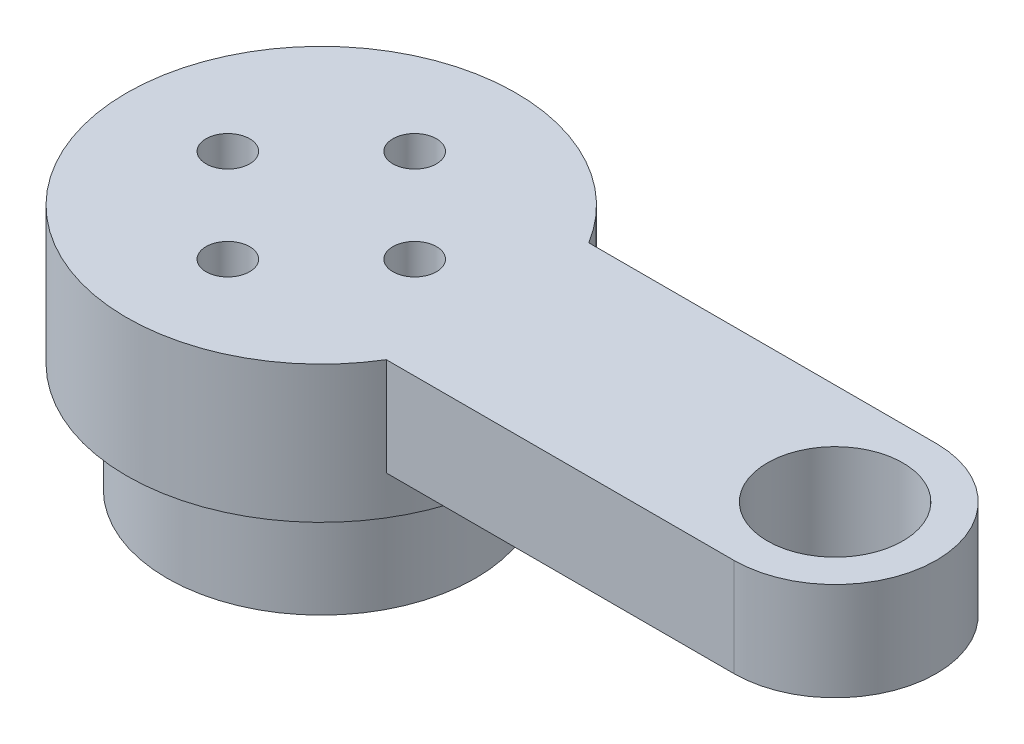
ISO-10303-21;
HEADER;
FILE_DESCRIPTION(('STEP AP214'),'2;1');
FILE_NAME('part.step','',(''),(''),'','','');
FILE_SCHEMA(('AUTOMOTIVE_DESIGN { 1 0 10303 214 1 1 1 1 }'));
ENDSEC;
DATA;
#1=APPLICATION_CONTEXT('core data for automotive mechanical design processes');
#2=APPLICATION_PROTOCOL_DEFINITION('international standard','automotive_design',2000,#1);
#3=PRODUCT_CONTEXT('',#1,'mechanical');
#4=PRODUCT('Part','Part','',(#3));
#5=PRODUCT_RELATED_PRODUCT_CATEGORY('part','',(#4));
#6=PRODUCT_DEFINITION_FORMATION('','',#4);
#7=PRODUCT_DEFINITION_CONTEXT('part definition',#1,'design');
#8=PRODUCT_DEFINITION('design','',#6,#7);
#9=PRODUCT_DEFINITION_SHAPE('','',#8);
#10=(LENGTH_UNIT() NAMED_UNIT(*) SI_UNIT(.MILLI.,.METRE.));
#11=(NAMED_UNIT(*) PLANE_ANGLE_UNIT() SI_UNIT($,.RADIAN.));
#12=(NAMED_UNIT(*) SI_UNIT($,.STERADIAN.) SOLID_ANGLE_UNIT());
#13=UNCERTAINTY_MEASURE_WITH_UNIT(LENGTH_MEASURE(1.E-05),#10,'distance_accuracy_value','');
#14=(GEOMETRIC_REPRESENTATION_CONTEXT(3) GLOBAL_UNCERTAINTY_ASSIGNED_CONTEXT((#13)) GLOBAL_UNIT_ASSIGNED_CONTEXT((#10,
#11,#12)) REPRESENTATION_CONTEXT('',''));
#15=CARTESIAN_POINT('',(0.,0.,0.));
#16=DIRECTION('',(0.,0.,1.));
#17=DIRECTION('',(1.,0.,0.));
#18=AXIS2_PLACEMENT_3D('',#15,#16,#17);
#19=CARTESIAN_POINT('',(0.,0.,0.));
#20=DIRECTION('',(0.,1.,0.));
#21=DIRECTION('',(0.,0.,1.));
#22=AXIS2_PLACEMENT_3D('',#19,#20,#21);
#23=PLANE('',#22);
#24=CARTESIAN_POINT('',(0.,0.,0.));
#25=DIRECTION('',(0.,1.,0.));
#26=DIRECTION('',(0.,0.,1.));
#27=AXIS2_PLACEMENT_3D('',#24,#25,#26);
#28=CIRCLE('',#27,9.9);
#29=CARTESIAN_POINT('',(0.,0.,9.9));
#30=VERTEX_POINT('',#29);
#31=EDGE_CURVE('E41',#30,#30,#28,.T.);
#32=ORIENTED_EDGE('',*,*,#31,.F.);
#33=EDGE_LOOP('',(#32));
#34=FACE_BOUND('',#33,.T.);
#35=CARTESIAN_POINT('',(6.,0.,0.));
#36=DIRECTION('',(0.,1.,0.));
#37=DIRECTION('',(0.,0.,1.));
#38=AXIS2_PLACEMENT_3D('',#35,#36,#37);
#39=CIRCLE('',#38,1.4);
#40=CARTESIAN_POINT('',(6.,0.,1.4));
#41=VERTEX_POINT('',#40);
#42=EDGE_CURVE('E147',#41,#41,#39,.T.);
#43=ORIENTED_EDGE('',*,*,#42,.T.);
#44=EDGE_LOOP('',(#43));
#45=FACE_BOUND('',#44,.T.);
#46=CARTESIAN_POINT('',(0.,0.,6.));
#47=DIRECTION('',(0.,1.,0.));
#48=DIRECTION('',(0.,0.,1.));
#49=AXIS2_PLACEMENT_3D('',#46,#47,#48);
#50=CIRCLE('',#49,1.4);
#51=CARTESIAN_POINT('',(0.,0.,7.4));
#52=VERTEX_POINT('',#51);
#53=EDGE_CURVE('E144',#52,#52,#50,.T.);
#54=ORIENTED_EDGE('',*,*,#53,.T.);
#55=EDGE_LOOP('',(#54));
#56=FACE_BOUND('',#55,.T.);
#57=CARTESIAN_POINT('',(-6.,0.,0.));
#58=DIRECTION('',(0.,1.,0.));
#59=DIRECTION('',(0.,0.,1.));
#60=AXIS2_PLACEMENT_3D('',#57,#58,#59);
#61=CIRCLE('',#60,1.4);
#62=CARTESIAN_POINT('',(-6.,0.,1.4));
#63=VERTEX_POINT('',#62);
#64=EDGE_CURVE('E141',#63,#63,#61,.T.);
#65=ORIENTED_EDGE('',*,*,#64,.T.);
#66=EDGE_LOOP('',(#65));
#67=FACE_BOUND('',#66,.T.);
#68=CARTESIAN_POINT('',(0.,0.,-6.));
#69=DIRECTION('',(0.,1.,0.));
#70=DIRECTION('',(0.,0.,1.));
#71=AXIS2_PLACEMENT_3D('',#68,#69,#70);
#72=CIRCLE('',#71,1.4);
#73=CARTESIAN_POINT('',(0.,0.,-4.6));
#74=VERTEX_POINT('',#73);
#75=EDGE_CURVE('E136',#74,#74,#72,.T.);
#76=ORIENTED_EDGE('',*,*,#75,.T.);
#77=EDGE_LOOP('',(#76));
#78=FACE_BOUND('',#77,.T.);
#79=ADVANCED_FACE('F37',(#34,#45,#56,#67,#78),#23,.F.);
#80=CARTESIAN_POINT('',(0.,7.,0.));
#81=DIRECTION('',(0.,-1.,0.));
#82=DIRECTION('',(0.,0.,-1.));
#83=AXIS2_PLACEMENT_3D('',#80,#81,#82);
#84=CYLINDRICAL_SURFACE('',#83,9.9);
#85=CARTESIAN_POINT('',(0.,7.,0.));
#86=DIRECTION('',(0.,1.,0.));
#87=DIRECTION('',(0.,0.,1.));
#88=AXIS2_PLACEMENT_3D('',#85,#86,#87);
#89=CIRCLE('',#88,9.9);
#90=CARTESIAN_POINT('',(0.,7.,9.9));
#91=VERTEX_POINT('',#90);
#92=EDGE_CURVE('E11',#91,#91,#89,.T.);
#93=ORIENTED_EDGE('',*,*,#92,.F.);
#94=EDGE_LOOP('',(#93));
#95=FACE_BOUND('',#94,.T.);
#96=ORIENTED_EDGE('',*,*,#31,.T.);
#97=EDGE_LOOP('',(#96));
#98=FACE_BOUND('',#97,.T.);
#99=ADVANCED_FACE('F39',(#95,#98),#84,.T.);
#100=CARTESIAN_POINT('',(6.,7.,0.));
#101=DIRECTION('',(0.,-1.,0.));
#102=DIRECTION('',(0.,0.,-1.));
#103=AXIS2_PLACEMENT_3D('',#100,#101,#102);
#104=CYLINDRICAL_SURFACE('',#103,1.4);
#105=ORIENTED_EDGE('',*,*,#42,.F.);
#106=EDGE_LOOP('',(#105));
#107=FACE_BOUND('',#106,.T.);
#108=CARTESIAN_POINT('',(6.,15.8,0.));
#109=DIRECTION('',(0.,1.,0.));
#110=DIRECTION('',(0.,0.,1.));
#111=AXIS2_PLACEMENT_3D('',#108,#109,#110);
#112=CIRCLE('',#111,1.4);
#113=CARTESIAN_POINT('',(6.,15.8,1.4));
#114=VERTEX_POINT('',#113);
#115=EDGE_CURVE('E113',#114,#114,#112,.F.);
#116=ORIENTED_EDGE('',*,*,#115,.F.);
#117=EDGE_LOOP('',(#116));
#118=FACE_BOUND('',#117,.T.);
#119=ADVANCED_FACE('F205',(#107,#118),#104,.F.);
#120=CARTESIAN_POINT('',(0.,7.,6.));
#121=DIRECTION('',(0.,-1.,0.));
#122=DIRECTION('',(0.,0.,-1.));
#123=AXIS2_PLACEMENT_3D('',#120,#121,#122);
#124=CYLINDRICAL_SURFACE('',#123,1.4);
#125=ORIENTED_EDGE('',*,*,#53,.F.);
#126=EDGE_LOOP('',(#125));
#127=FACE_BOUND('',#126,.T.);
#128=CARTESIAN_POINT('',(0.,15.8,6.));
#129=DIRECTION('',(0.,1.,0.));
#130=DIRECTION('',(0.,0.,1.));
#131=AXIS2_PLACEMENT_3D('',#128,#129,#130);
#132=CIRCLE('',#131,1.4);
#133=CARTESIAN_POINT('',(0.,15.8,7.4));
#134=VERTEX_POINT('',#133);
#135=EDGE_CURVE('E116',#134,#134,#132,.F.);
#136=ORIENTED_EDGE('',*,*,#135,.F.);
#137=EDGE_LOOP('',(#136));
#138=FACE_BOUND('',#137,.T.);
#139=ADVANCED_FACE('F201',(#127,#138),#124,.F.);
#140=CARTESIAN_POINT('',(-6.,7.,0.));
#141=DIRECTION('',(0.,-1.,0.));
#142=DIRECTION('',(0.,0.,-1.));
#143=AXIS2_PLACEMENT_3D('',#140,#141,#142);
#144=CYLINDRICAL_SURFACE('',#143,1.4);
#145=ORIENTED_EDGE('',*,*,#64,.F.);
#146=EDGE_LOOP('',(#145));
#147=FACE_BOUND('',#146,.T.);
#148=CARTESIAN_POINT('',(-6.,15.8,0.));
#149=DIRECTION('',(0.,1.,0.));
#150=DIRECTION('',(0.,0.,1.));
#151=AXIS2_PLACEMENT_3D('',#148,#149,#150);
#152=CIRCLE('',#151,1.4);
#153=CARTESIAN_POINT('',(-6.,15.8,1.4));
#154=VERTEX_POINT('',#153);
#155=EDGE_CURVE('E107',#154,#154,#152,.F.);
#156=ORIENTED_EDGE('',*,*,#155,.F.);
#157=EDGE_LOOP('',(#156));
#158=FACE_BOUND('',#157,.T.);
#159=ADVANCED_FACE('F167',(#147,#158),#144,.F.);
#160=CARTESIAN_POINT('',(0.,7.,-6.));
#161=DIRECTION('',(0.,-1.,0.));
#162=DIRECTION('',(0.,0.,-1.));
#163=AXIS2_PLACEMENT_3D('',#160,#161,#162);
#164=CYLINDRICAL_SURFACE('',#163,1.4);
#165=ORIENTED_EDGE('',*,*,#75,.F.);
#166=EDGE_LOOP('',(#165));
#167=FACE_BOUND('',#166,.T.);
#168=CARTESIAN_POINT('',(0.,15.8,-6.));
#169=DIRECTION('',(0.,1.,0.));
#170=DIRECTION('',(0.,0.,1.));
#171=AXIS2_PLACEMENT_3D('',#168,#169,#170);
#172=CIRCLE('',#171,1.4);
#173=CARTESIAN_POINT('',(0.,15.8,-4.6));
#174=VERTEX_POINT('',#173);
#175=EDGE_CURVE('E119',#174,#174,#172,.F.);
#176=ORIENTED_EDGE('',*,*,#175,.F.);
#177=EDGE_LOOP('',(#176));
#178=FACE_BOUND('',#177,.T.);
#179=ADVANCED_FACE('F163',(#167,#178),#164,.F.);
#180=CARTESIAN_POINT('',(0.,7.,0.));
#181=DIRECTION('',(0.,1.,0.));
#182=DIRECTION('',(0.,0.,1.));
#183=AXIS2_PLACEMENT_3D('',#180,#181,#182);
#184=PLANE('',#183);
#185=ORIENTED_EDGE('',*,*,#92,.T.);
#186=EDGE_LOOP('',(#185));
#187=FACE_BOUND('',#186,.T.);
#188=CARTESIAN_POINT('',(0.,7.,0.));
#189=DIRECTION('',(0.,1.,0.));
#190=DIRECTION('',(0.,0.,1.));
#191=AXIS2_PLACEMENT_3D('',#188,#189,#190);
#192=CIRCLE('',#191,12.5);
#193=CARTESIAN_POINT('',(0.,7.,12.5));
#194=VERTEX_POINT('',#193);
#195=EDGE_CURVE('E134',#194,#194,#192,.T.);
#196=ORIENTED_EDGE('',*,*,#195,.F.);
#197=EDGE_LOOP('',(#196));
#198=FACE_BOUND('',#197,.T.);
#199=ADVANCED_FACE('F166',(#187,#198),#184,.F.);
#200=CARTESIAN_POINT('',(0.,9.5,0.));
#201=DIRECTION('',(0.,-1.,0.));
#202=DIRECTION('',(0.,0.,-1.));
#203=AXIS2_PLACEMENT_3D('',#200,#201,#202);
#204=CYLINDRICAL_SURFACE('',#203,12.5);
#205=CARTESIAN_POINT('',(0.,9.5,0.));
#206=DIRECTION('',(0.,1.,0.));
#207=DIRECTION('',(0.,0.,1.));
#208=AXIS2_PLACEMENT_3D('',#205,#206,#207);
#209=CIRCLE('',#208,12.5);
#210=CARTESIAN_POINT('',(10.6770782520313,9.5,6.5));
#211=VERTEX_POINT('',#210);
#212=CARTESIAN_POINT('',(10.6770782520313,9.5,-6.5));
#213=VERTEX_POINT('',#212);
#214=EDGE_CURVE('E52',#211,#213,#209,.T.);
#215=ORIENTED_EDGE('',*,*,#214,.F.);
#216=DIRECTION('',(0.,-1.,0.));
#217=VECTOR('',#216,1.);
#218=CARTESIAN_POINT('',(10.6770782520313,15.8,6.5));
#219=LINE('',#218,#217);
#220=CARTESIAN_POINT('',(10.6770782520313,15.8,6.5));
#221=VERTEX_POINT('',#220);
#222=EDGE_CURVE('E100',#221,#211,#219,.T.);
#223=ORIENTED_EDGE('',*,*,#222,.F.);
#224=CARTESIAN_POINT('',(0.,15.8,0.));
#225=DIRECTION('',(0.,1.,0.));
#226=DIRECTION('',(0.,0.,1.));
#227=AXIS2_PLACEMENT_3D('',#224,#225,#226);
#228=CIRCLE('',#227,12.5);
#229=CARTESIAN_POINT('',(10.6770782520313,15.8,-6.5));
#230=VERTEX_POINT('',#229);
#231=EDGE_CURVE('E89',#230,#221,#228,.T.);
#232=ORIENTED_EDGE('',*,*,#231,.F.);
#233=DIRECTION('',(0.,-1.,0.));
#234=VECTOR('',#233,1.);
#235=CARTESIAN_POINT('',(10.6770782520313,15.8,-6.5));
#236=LINE('',#235,#234);
#237=EDGE_CURVE('E95',#230,#213,#236,.T.);
#238=ORIENTED_EDGE('',*,*,#237,.T.);
#239=EDGE_LOOP('',(#215,#223,#232,#238));
#240=FACE_BOUND('',#239,.T.);
#241=ORIENTED_EDGE('',*,*,#195,.T.);
#242=EDGE_LOOP('',(#241));
#243=FACE_BOUND('',#242,.T.);
#244=ADVANCED_FACE('F102',(#240,#243),#204,.T.);
#245=CARTESIAN_POINT('',(0.,9.5,0.));
#246=DIRECTION('',(0.,1.,0.));
#247=DIRECTION('',(0.,0.,1.));
#248=AXIS2_PLACEMENT_3D('',#245,#246,#247);
#249=PLANE('',#248);
#250=CARTESIAN_POINT('',(33.,9.5,0.));
#251=DIRECTION('',(0.,1.,0.));
#252=DIRECTION('',(0.,0.,1.));
#253=AXIS2_PLACEMENT_3D('',#250,#251,#252);
#254=CIRCLE('',#253,4.35);
#255=CARTESIAN_POINT('',(33.,9.5,4.35));
#256=VERTEX_POINT('',#255);
#257=EDGE_CURVE('E122',#256,#256,#254,.T.);
#258=ORIENTED_EDGE('',*,*,#257,.T.);
#259=EDGE_LOOP('',(#258));
#260=FACE_BOUND('',#259,.T.);
#261=DIRECTION('',(-1.,0.,0.));
#262=VECTOR('',#261,1.);
#263=CARTESIAN_POINT('',(0.,9.5,6.50000000000001));
#264=LINE('',#263,#262);
#265=CARTESIAN_POINT('',(33.,9.5,6.5));
#266=VERTEX_POINT('',#265);
#267=EDGE_CURVE('E128',#266,#211,#264,.T.);
#268=ORIENTED_EDGE('',*,*,#267,.T.);
#269=ORIENTED_EDGE('',*,*,#214,.T.);
#270=DIRECTION('',(-1.,0.,0.));
#271=VECTOR('',#270,1.);
#272=CARTESIAN_POINT('',(0.,9.5,-6.50000000000001));
#273=LINE('',#272,#271);
#274=CARTESIAN_POINT('',(33.,9.5,-6.5));
#275=VERTEX_POINT('',#274);
#276=EDGE_CURVE('E97',#275,#213,#273,.T.);
#277=ORIENTED_EDGE('',*,*,#276,.F.);
#278=CARTESIAN_POINT('',(33.,9.5,0.));
#279=DIRECTION('',(0.,1.,0.));
#280=DIRECTION('',(0.,0.,1.));
#281=AXIS2_PLACEMENT_3D('',#278,#279,#280);
#282=CIRCLE('',#281,6.5);
#283=EDGE_CURVE('E125',#266,#275,#282,.T.);
#284=ORIENTED_EDGE('',*,*,#283,.F.);
#285=EDGE_LOOP('',(#268,#269,#277,#284));
#286=FACE_BOUND('',#285,.T.);
#287=ADVANCED_FACE('F183',(#260,#286),#249,.F.);
#288=CARTESIAN_POINT('',(33.,15.8,0.));
#289=DIRECTION('',(0.,-1.,0.));
#290=DIRECTION('',(0.,0.,-1.));
#291=AXIS2_PLACEMENT_3D('',#288,#289,#290);
#292=CYLINDRICAL_SURFACE('',#291,6.5);
#293=ORIENTED_EDGE('',*,*,#283,.T.);
#294=DIRECTION('',(0.,-1.,0.));
#295=VECTOR('',#294,1.);
#296=CARTESIAN_POINT('',(33.,15.8,-6.5));
#297=LINE('',#296,#295);
#298=CARTESIAN_POINT('',(33.,15.8,-6.5));
#299=VERTEX_POINT('',#298);
#300=EDGE_CURVE('E99',#299,#275,#297,.T.);
#301=ORIENTED_EDGE('',*,*,#300,.F.);
#302=CARTESIAN_POINT('',(33.,15.8,0.));
#303=DIRECTION('',(0.,1.,0.));
#304=DIRECTION('',(0.,0.,1.));
#305=AXIS2_PLACEMENT_3D('',#302,#303,#304);
#306=CIRCLE('',#305,6.5);
#307=CARTESIAN_POINT('',(33.,15.8,6.5));
#308=VERTEX_POINT('',#307);
#309=EDGE_CURVE('E91',#308,#299,#306,.T.);
#310=ORIENTED_EDGE('',*,*,#309,.F.);
#311=DIRECTION('',(0.,-1.,0.));
#312=VECTOR('',#311,1.);
#313=CARTESIAN_POINT('',(33.,15.8,6.5));
#314=LINE('',#313,#312);
#315=EDGE_CURVE('E61',#308,#266,#314,.T.);
#316=ORIENTED_EDGE('',*,*,#315,.T.);
#317=EDGE_LOOP('',(#293,#301,#310,#316));
#318=FACE_BOUND('',#317,.T.);
#319=ADVANCED_FACE('F186',(#318),#292,.T.);
#320=CARTESIAN_POINT('',(0.,15.8,-6.50000000000001));
#321=DIRECTION('',(0.,0.,1.));
#322=DIRECTION('',(1.,0.,0.));
#323=AXIS2_PLACEMENT_3D('',#320,#321,#322);
#324=PLANE('',#323);
#325=ORIENTED_EDGE('',*,*,#276,.T.);
#326=ORIENTED_EDGE('',*,*,#237,.F.);
#327=DIRECTION('',(-1.,0.,0.));
#328=VECTOR('',#327,1.);
#329=CARTESIAN_POINT('',(0.,15.8,-6.50000000000001));
#330=LINE('',#329,#328);
#331=EDGE_CURVE('E82',#299,#230,#330,.T.);
#332=ORIENTED_EDGE('',*,*,#331,.F.);
#333=ORIENTED_EDGE('',*,*,#300,.T.);
#334=EDGE_LOOP('',(#325,#326,#332,#333));
#335=FACE_BOUND('',#334,.T.);
#336=ADVANCED_FACE('F96',(#335),#324,.F.);
#337=CARTESIAN_POINT('',(0.,15.8,6.50000000000001));
#338=DIRECTION('',(0.,0.,1.));
#339=DIRECTION('',(1.,0.,0.));
#340=AXIS2_PLACEMENT_3D('',#337,#338,#339);
#341=PLANE('',#340);
#342=ORIENTED_EDGE('',*,*,#267,.F.);
#343=ORIENTED_EDGE('',*,*,#315,.F.);
#344=DIRECTION('',(-1.,0.,0.));
#345=VECTOR('',#344,1.);
#346=CARTESIAN_POINT('',(0.,15.8,6.50000000000001));
#347=LINE('',#346,#345);
#348=EDGE_CURVE('E105',#308,#221,#347,.T.);
#349=ORIENTED_EDGE('',*,*,#348,.T.);
#350=ORIENTED_EDGE('',*,*,#222,.T.);
#351=EDGE_LOOP('',(#342,#343,#349,#350));
#352=FACE_BOUND('',#351,.T.);
#353=ADVANCED_FACE('F178',(#352),#341,.T.);
#354=CARTESIAN_POINT('',(33.,15.8,0.));
#355=DIRECTION('',(0.,-1.,0.));
#356=DIRECTION('',(0.,0.,-1.));
#357=AXIS2_PLACEMENT_3D('',#354,#355,#356);
#358=CYLINDRICAL_SURFACE('',#357,4.35);
#359=CARTESIAN_POINT('',(33.,15.8,0.));
#360=DIRECTION('',(0.,1.,0.));
#361=DIRECTION('',(0.,0.,1.));
#362=AXIS2_PLACEMENT_3D('',#359,#360,#361);
#363=CIRCLE('',#362,4.35);
#364=CARTESIAN_POINT('',(33.,15.8,4.35));
#365=VERTEX_POINT('',#364);
#366=EDGE_CURVE('E130',#365,#365,#363,.T.);
#367=ORIENTED_EDGE('',*,*,#366,.T.);
#368=EDGE_LOOP('',(#367));
#369=FACE_BOUND('',#368,.T.);
#370=ORIENTED_EDGE('',*,*,#257,.F.);
#371=EDGE_LOOP('',(#370));
#372=FACE_BOUND('',#371,.T.);
#373=ADVANCED_FACE('F172',(#369,#372),#358,.F.);
#374=CARTESIAN_POINT('',(0.,15.8,0.));
#375=DIRECTION('',(0.,1.,0.));
#376=DIRECTION('',(0.,0.,1.));
#377=AXIS2_PLACEMENT_3D('',#374,#375,#376);
#378=PLANE('',#377);
#379=ORIENTED_EDGE('',*,*,#366,.F.);
#380=EDGE_LOOP('',(#379));
#381=FACE_BOUND('',#380,.T.);
#382=ORIENTED_EDGE('',*,*,#309,.T.);
#383=ORIENTED_EDGE('',*,*,#331,.T.);
#384=ORIENTED_EDGE('',*,*,#231,.T.);
#385=ORIENTED_EDGE('',*,*,#348,.F.);
#386=EDGE_LOOP('',(#382,#383,#384,#385));
#387=FACE_BOUND('',#386,.T.);
#388=ORIENTED_EDGE('',*,*,#155,.T.);
#389=EDGE_LOOP('',(#388));
#390=FACE_BOUND('',#389,.T.);
#391=ORIENTED_EDGE('',*,*,#115,.T.);
#392=EDGE_LOOP('',(#391));
#393=FACE_BOUND('',#392,.T.);
#394=ORIENTED_EDGE('',*,*,#135,.T.);
#395=EDGE_LOOP('',(#394));
#396=FACE_BOUND('',#395,.T.);
#397=ORIENTED_EDGE('',*,*,#175,.T.);
#398=EDGE_LOOP('',(#397));
#399=FACE_BOUND('',#398,.T.);
#400=ADVANCED_FACE('F85',(#381,#387,#390,#393,#396,#399),#378,.T.);
#401=CLOSED_SHELL('',(#79,#99,#119,#139,#159,#179,#199,#244,#287,#319,#336,#353,#373,#400));
#402=MANIFOLD_SOLID_BREP('B2',#401);
#403=ADVANCED_BREP_SHAPE_REPRESENTATION('',(#18,#402),#14);
#404=SHAPE_DEFINITION_REPRESENTATION(#9,#403);
ENDSEC;
END-ISO-10303-21;
